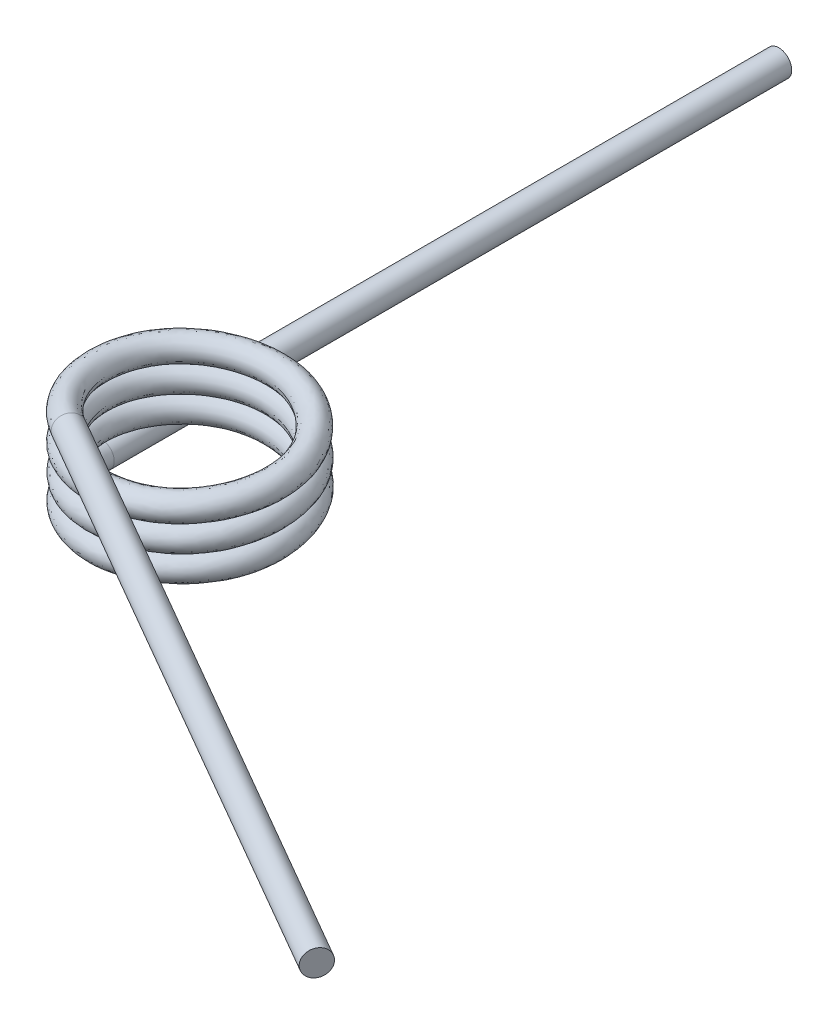
ISO-10303-21;
HEADER;
FILE_DESCRIPTION(('STEP AP214'),'2;1');
FILE_NAME('part.step','',(''),(''),'','','');
FILE_SCHEMA(('AUTOMOTIVE_DESIGN { 1 0 10303 214 1 1 1 1 }'));
ENDSEC;
DATA;
#1=APPLICATION_CONTEXT('core data for automotive mechanical design processes');
#2=APPLICATION_PROTOCOL_DEFINITION('international standard','automotive_design',2000,#1);
#3=PRODUCT_CONTEXT('',#1,'mechanical');
#4=PRODUCT('Part','Part','',(#3));
#5=PRODUCT_RELATED_PRODUCT_CATEGORY('part','',(#4));
#6=PRODUCT_DEFINITION_FORMATION('','',#4);
#7=PRODUCT_DEFINITION_CONTEXT('part definition',#1,'design');
#8=PRODUCT_DEFINITION('design','',#6,#7);
#9=PRODUCT_DEFINITION_SHAPE('','',#8);
#10=(LENGTH_UNIT() NAMED_UNIT(*) SI_UNIT(.MILLI.,.METRE.));
#11=(NAMED_UNIT(*) PLANE_ANGLE_UNIT() SI_UNIT($,.RADIAN.));
#12=(NAMED_UNIT(*) SI_UNIT($,.STERADIAN.) SOLID_ANGLE_UNIT());
#13=UNCERTAINTY_MEASURE_WITH_UNIT(LENGTH_MEASURE(1.E-05),#10,'distance_accuracy_value','');
#14=(GEOMETRIC_REPRESENTATION_CONTEXT(3) GLOBAL_UNCERTAINTY_ASSIGNED_CONTEXT((#13)) GLOBAL_UNIT_ASSIGNED_CONTEXT((#10,
#11,#12)) REPRESENTATION_CONTEXT('',''));
#15=CARTESIAN_POINT('',(0.,0.,0.));
#16=DIRECTION('',(0.,0.,1.));
#17=DIRECTION('',(1.,0.,0.));
#18=AXIS2_PLACEMENT_3D('',#15,#16,#17);
#19=CARTESIAN_POINT('',(31.2249907475932,4.75,23.9167295593006));
#20=DIRECTION('',(-0.86602540378444,0.,-0.499999999999998));
#21=DIRECTION('',(0.499999999999998,0.,-0.86602540378444));
#22=AXIS2_PLACEMENT_3D('',#19,#20,#21);
#23=PLANE('',#22);
#24=CARTESIAN_POINT('',(31.2249907475932,4.75,23.9167295593006));
#25=DIRECTION('',(0.86602540378444,0.,0.499999999999998));
#26=DIRECTION('',(0.499999999999998,0.,-0.86602540378444));
#27=AXIS2_PLACEMENT_3D('',#24,#25,#26);
#28=CIRCLE('',#27,0.745000000000001);
#29=CARTESIAN_POINT('',(31.5974907475932,4.75,23.2715406334812));
#30=VERTEX_POINT('',#29);
#31=EDGE_CURVE('E52',#30,#30,#28,.T.);
#32=ORIENTED_EDGE('',*,*,#31,.T.);
#33=EDGE_LOOP('',(#32));
#34=FACE_BOUND('',#33,.T.);
#35=ADVANCED_FACE('F37',(#34),#23,.F.);
#36=CARTESIAN_POINT('',(-5.10000000000001,0.,-39.));
#37=DIRECTION('',(0.,0.,-1.));
#38=DIRECTION('',(0.999999993495773,0.000114054609235302,0.));
#39=AXIS2_PLACEMENT_3D('',#36,#37,#38);
#40=PLANE('',#39);
#41=CARTESIAN_POINT('',(-5.10000000000001,0.,-39.));
#42=DIRECTION('',(0.,0.,1.));
#43=DIRECTION('',(0.999999993495773,0.000114054609235302,0.));
#44=AXIS2_PLACEMENT_3D('',#41,#42,#43);
#45=CIRCLE('',#44,0.745000000000001);
#46=CARTESIAN_POINT('',(-4.35500000484565,8.49706838837695E-05,-39.));
#47=VERTEX_POINT('',#46);
#48=EDGE_CURVE('E46',#47,#47,#45,.T.);
#49=ORIENTED_EDGE('',*,*,#48,.F.);
#50=EDGE_LOOP('',(#49));
#51=FACE_BOUND('',#50,.T.);
#52=ADVANCED_FACE('F121',(#51),#40,.T.);
#53=CARTESIAN_POINT('',(-2.54999999999986,4.75,4.41672955930073));
#54=DIRECTION('',(0.86602540378444,0.,0.499999999999998));
#55=DIRECTION('',(-0.499999999999998,0.,0.86602540378444));
#56=AXIS2_PLACEMENT_3D('',#53,#54,#55);
#57=CYLINDRICAL_SURFACE('',#56,0.745000000000001);
#58=ORIENTED_EDGE('',*,*,#31,.F.);
#59=EDGE_LOOP('',(#58));
#60=FACE_BOUND('',#59,.T.);
#61=CARTESIAN_POINT('',(-2.54999999999986,4.75,4.41672955930072));
#62=DIRECTION('',(0.865078141904125,0.0467590761205418,0.49945309809837));
#63=DIRECTION('',(0.499999999999971,0.,-0.866025403784455));
#64=AXIS2_PLACEMENT_3D('',#61,#62,#63);
#65=CIRCLE('',#64,0.745000000000001);
#66=CARTESIAN_POINT('',(-2.17749999999988,4.75,3.77154063348131));
#67=VERTEX_POINT('',#66);
#68=EDGE_CURVE('E40',#67,#67,#65,.T.);
#69=ORIENTED_EDGE('',*,*,#68,.T.);
#70=EDGE_LOOP('',(#69));
#71=FACE_BOUND('',#70,.T.);
#72=ADVANCED_FACE('F87',(#60,#71),#57,.T.);
#73=CARTESIAN_POINT('',(-4.35500000484566,8.4877742623831E-05,-3.97315071815063E-06));
#74=CARTESIAN_POINT('',(-4.35500049170202,0.0318251134411877,0.580614354438543));
#75=CARTESIAN_POINT('',(-4.23649721866778,0.063729367407448,1.15898934681182));
#76=CARTESIAN_POINT('',(-3.34382063298611,0.189542885597735,3.28676576476937));
#77=CARTESIAN_POINT('',(-1.64198350085021,0.285312357409099,4.39030935080915));
#78=CARTESIAN_POINT('',(1.82038378485511,0.474574749289196,4.31786427379338));
#79=CARTESIAN_POINT('',(3.47975661831981,0.570680960795654,3.13679904669797));
#80=CARTESIAN_POINT('',(4.6839424903672,0.759399147763516,-0.100663864274794));
#81=CARTESIAN_POINT('',(4.19578314370466,0.855808187502097,-2.08224169545152));
#82=CARTESIAN_POINT('',(1.63240436818566,1.04427251357359,-4.39049577210398));
#83=CARTESIAN_POINT('',(-0.393091437395059,1.14090778587485,-4.66687505817929));
#84=CARTESIAN_POINT('',(-3.28620030909251,1.31737576799788,-3.23081301512258));
#85=CARTESIAN_POINT('',(-4.24568962950082,1.40117141018875,-1.79832159252085));
#86=CARTESIAN_POINT('',(-4.46414136402237,1.58364356683938,1.51850371389457));
#87=CARTESIAN_POINT('',(-3.33398435375743,1.68231651922826,3.33163819513206));
#88=CARTESIAN_POINT('',(0.00172474381694135,1.88037268477069,4.71531052251249));
#89=CARTESIAN_POINT('',(2.08468449364732,1.97945582915349,4.22659895091506));
#90=CARTESIAN_POINT('',(4.46420956670509,2.17696977865345,1.51568252556366));
#91=CARTESIAN_POINT('',(4.67193967777642,2.27665500806439,-0.617961506534757));
#92=CARTESIAN_POINT('',(2.90720385488493,2.46948952573049,-3.67457675764206));
#93=CARTESIAN_POINT('',(1.07004084216657,2.56581083547879,-4.56023571166635));
#94=CARTESIAN_POINT('',(-2.34230030936542,2.75426742698741,-4.05634457904224));
#95=CARTESIAN_POINT('',(-3.84659862477311,2.85093068165208,-2.67149936493476));
#96=CARTESIAN_POINT('',(-4.63326245470203,3.039151741324,0.682515674619303));
#97=CARTESIAN_POINT('',(-3.89952833681768,3.13595758715839,2.59332510242046));
#98=CARTESIAN_POINT('',(-1.07137739662564,3.3241281359151,4.55889107358654));
#99=CARTESIAN_POINT('',(0.974999867533546,3.42091086631926,4.5808468289081));
#100=CARTESIAN_POINT('',(3.84508417751437,3.60917709184034,2.67386817721572));
#101=CARTESIAN_POINT('',(4.61848238139732,3.70581236414485,0.781548440294886));
#102=CARTESIAN_POINT('',(3.90116810590661,3.8942766902123,-2.59253037609087));
#103=CARTESIAN_POINT('',(2.42915237050127,3.99068572995327,-4.00607907497628));
#104=CARTESIAN_POINT('',(-0.97666517729352,4.17940391691991,-4.58195800797555));
#105=CARTESIAN_POINT('',(-2.82918487864243,4.27551012841177,-3.73543333767367));
#106=CARTESIAN_POINT('',(-4.62311044298779,4.46477252033562,-0.773159450934701));
#107=CARTESIAN_POINT('',(-4.51833416186937,4.56054199214867,1.25244664888496));
#108=CARTESIAN_POINT('',(-3.12196563467214,4.68635551025648,3.0894166834495));
#109=CARTESIAN_POINT('',(-2.68033020665044,4.71825976418374,3.48123144049018));
#110=CARTESIAN_POINT('',(-2.17749999999989,4.75,3.77154063348131));
#111=CARTESIAN_POINT('',(-4.3550444953917,0.38973929085154,-0.0182438043106747));
#112=CARTESIAN_POINT('',(-4.3574306773005,0.421479017671261,0.562370637803314));
#113=CARTESIAN_POINT('',(-4.24143373838931,0.453383421192855,1.14127095934507));
#114=CARTESIAN_POINT('',(-3.35732175797539,0.579197318637322,3.27265354469486));
#115=CARTESIAN_POINT('',(-1.66037831683068,0.674966753419761,4.38361648446119));
#116=CARTESIAN_POINT('',(1.80230383102391,0.864228999832589,4.32536030468173));
#117=CARTESIAN_POINT('',(3.46679615786637,0.960335234595801,3.15145140883677));
#118=CARTESIAN_POINT('',(4.68422639277113,1.14905345994167,-0.0811043425544822));
#119=CARTESIAN_POINT('',(4.20464174518784,1.24546246580037,-2.06480433178418));
#120=CARTESIAN_POINT('',(1.65068884393225,1.43392682339603,-4.3835528539704));
#121=CARTESIAN_POINT('',(-0.373620759624214,1.53056206393764,-4.66869917807277));
#122=CARTESIAN_POINT('',(-3.27261714852066,1.70703007601791,-3.2444604959463));
#123=CARTESIAN_POINT('',(-4.23812742948987,1.79082613925565,-1.81611002307953));
#124=CARTESIAN_POINT('',(-4.4706084694056,1.97329766548903,1.49980823635831));
#125=CARTESIAN_POINT('',(-3.34795401276403,2.07197143910668,3.31768534042661));
#126=CARTESIAN_POINT('',(-0.0180403796332627,2.27002653825817,4.71537739474777));
#127=CARTESIAN_POINT('',(2.06704907975083,2.36911060368314,4.23540387823056));
#128=CARTESIAN_POINT('',(4.45784688677571,2.56662365282058,1.53435744287542));
#129=CARTESIAN_POINT('',(4.6747074005595,2.66630928507762,-0.598484136233415));
#130=CARTESIAN_POINT('',(2.92246185337478,2.85914383612168,-3.66233179745202));
#131=CARTESIAN_POINT('',(1.08912348397895,2.95546511320492,-4.55594663460747));
#132=CARTESIAN_POINT('',(-2.3252959441487,3.14392173734658,-4.06600699417536));
#133=CARTESIAN_POINT('',(-3.83559468256182,3.24058495935131,-2.68766510414871));
#134=CARTESIAN_POINT('',(-4.63597819024973,3.42880605171079,0.663150434851775));
#135=CARTESIAN_POINT('',(-3.91050923386143,3.5256118647574,2.57714451170451));
#136=CARTESIAN_POINT('',(-1.09038141669799,3.71378244640268,4.55428586189826));
#137=CARTESIAN_POINT('',(0.955911186190963,3.81056514375629,4.58509727078069));
#138=CARTESIAN_POINT('',(3.83380861711362,3.99883140249007,2.68984538124814));
#139=CARTESIAN_POINT('',(4.61540012710842,4.09546664134996,0.800862976099092));
#140=CARTESIAN_POINT('',(3.91187980144788,4.28393100113013,-2.57616667756522));
#141=CARTESIAN_POINT('',(2.44597455270861,4.38034000938844,-3.99609432698432));
#142=CARTESIAN_POINT('',(-0.95750588145527,4.56905822342076,-4.58590277047718));
#143=CARTESIAN_POINT('',(-2.81368190912862,4.66516434884167,-3.74738141755824));
#144=CARTESIAN_POINT('',(-4.61975659764474,4.85442694762664,-0.792443928115588));
#145=CARTESIAN_POINT('',(-4.52385147960822,4.95019637584874,1.2337107799021));
#146=CARTESIAN_POINT('',(-3.13487375476189,5.07600957814852,3.07631401487484));
#147=CARTESIAN_POINT('',(-2.69494216834125,5.10791365766567,3.47004045707954));
#148=CARTESIAN_POINT('',(-2.19329615724789,5.13965441564331,3.76242071784201));
#149=CARTESIAN_POINT('',(-4.71000388540033,0.74422955320838,-0.0348375918200958));
#150=CARTESIAN_POINT('',(-4.71455967713253,0.776075123285141,0.594473174597862));
#151=CARTESIAN_POINT('',(-4.59163304718302,0.807781040852514,1.21853993434564));
#152=CARTESIAN_POINT('',(-3.64119863483831,0.934101416256235,3.52986305417131));
#153=CARTESIAN_POINT('',(-1.81309820877475,1.02922768950069,4.73536929162904));
#154=CARTESIAN_POINT('',(1.93640113694846,1.21897955229465,4.68402671420544));
#155=CARTESIAN_POINT('',(3.73781945985087,1.3145847279768,3.42250394913862));
#156=CARTESIAN_POINT('',(5.06698587987142,1.50382504584378,-0.073595135272259));
#157=CARTESIAN_POINT('',(4.5562930567729,1.59971260049839,-2.21715158774708));
#158=CARTESIAN_POINT('',(1.79871144232021,1.78869741486976,-4.73653229137578));
#159=CARTESIAN_POINT('',(-0.3859570754249,1.88481246259036,-5.0516798270641));
#160=CARTESIAN_POINT('',(-3.52981044259895,2.06176782940759,-3.51931634967181));
#161=CARTESIAN_POINT('',(-4.57732636628793,2.1454155726667,-1.97819271011646));
#162=CARTESIAN_POINT('',(-4.84025928792386,2.32768000475887,1.60547371382181));
#163=CARTESIAN_POINT('',(-3.63231693014202,2.42649103322875,3.57655020059201));
#164=CARTESIAN_POINT('',(-0.0363415266428423,2.6244781554662,5.09954733878323));
#165=CARTESIAN_POINT('',(2.22024333216342,2.7235041443518,4.58862591388376));
#166=CARTESIAN_POINT('',(4.81629870354265,2.92120768729321,1.67439859419247));
#167=CARTESIAN_POINT('',(5.05913211866519,3.02054793186109,-0.629119630122376));
#168=CARTESIAN_POINT('',(3.17215984485344,3.21391505086623,-3.95258351228918));
#169=CARTESIAN_POINT('',(1.19588447681013,3.30971523754061,-4.92401349945209));
#170=CARTESIAN_POINT('',(-2.50291005335415,3.49869233866161,-4.40505321815508));
#171=CARTESIAN_POINT('',(-4.13856316956631,3.59483541492575,-2.92224861443001));
#172=CARTESIAN_POINT('',(-5.01655131330705,3.7835763332775,0.703311890226331));
#173=CARTESIAN_POINT('',(-4.24011786905383,3.87986239603597,2.77250724674309));
#174=CARTESIAN_POINT('',(-1.19316630797024,4.06855266137943,4.92289554942145));
#175=CARTESIAN_POINT('',(1.0161580276061,4.16481555030268,4.96351542009352));
#176=CARTESIAN_POINT('',(4.13875830423228,4.35360174832534,2.92106691394328));
#177=CARTESIAN_POINT('',(4.98944909100381,4.4497167928321,0.884298869044787));
#178=CARTESIAN_POINT('',(4.23909700445409,4.63870161138185,-2.77473204574996));
#179=CARTESIAN_POINT('',(2.66143819701573,4.73458917061701,-4.31312278164007));
#180=CARTESIAN_POINT('',(-1.02186074916009,4.92382946687584,-4.96327742408375));
#181=CARTESIAN_POINT('',(-3.0290118780021,5.01943443375035,-4.06455226657031));
#182=CARTESIAN_POINT('',(-4.99459760573741,5.20918696946636,-0.87114437221762));
#183=CARTESIAN_POINT('',(-4.8985371209887,5.30431323017871,1.31684712085486));
#184=CARTESIAN_POINT('',(-3.40034917397227,5.43063227806782,3.31709039507403));
#185=CARTESIAN_POINT('',(-2.92787544230098,5.46233748830618,3.74287570170657));
#186=CARTESIAN_POINT('',(-2.38512789418403,5.49418511616661,4.06149167185719));
#187=CARTESIAN_POINT('',(-5.49016605596745,0.744140669444154,-0.0348334311464499));
#188=CARTESIAN_POINT('',(-5.49472007089267,0.776222162641322,0.701527246462671));
#189=CARTESIAN_POINT('',(-5.35154782484295,0.807489233928933,1.42382489031075));
#190=CARTESIAN_POINT('',(-4.23819807728199,0.934922161312581,4.12347052582096));
#191=CARTESIAN_POINT('',(-2.11200858904863,1.02863474820489,5.52195765151017));
#192=CARTESIAN_POINT('',(2.26732596793801,1.21946314828396,5.4574343594456));
#193=CARTESIAN_POINT('',(4.35948809007298,1.31396687842377,3.9890112041721));
#194=CARTESIAN_POINT('',(5.90777778839171,1.50435475305072,-0.0962078746411478));
#195=CARTESIAN_POINT('',(5.31155537925926,1.59909615165868,-2.58690722051508));
#196=CARTESIAN_POINT('',(2.08751718471482,1.78922494088962,-5.52631706227848));
#197=CARTESIAN_POINT('',(-0.452015405116702,1.88419659443169,-5.889877445848));
#198=CARTESIAN_POINT('',(-4.12232415152492,2.06222317625975,-4.09619359038129));
#199=CARTESIAN_POINT('',(-5.33805820345847,2.14554404904724,-2.29889661459002));
#200=CARTESIAN_POINT('',(-5.63987007520941,2.32735451964162,1.87513239529861));
#201=CARTESIAN_POINT('',(-4.22944769062727,2.42646561131303,4.17347763743608));
#202=CARTESIAN_POINT('',(-0.0370398000456911,2.62430544341754,5.94387369228625));
#203=CARTESIAN_POINT('',(2.59225688388097,2.72320192973877,5.34744825929847));
#204=CARTESIAN_POINT('',(5.61695206507592,2.92132600584084,1.94487909923312));
#205=CARTESIAN_POINT('',(5.89861680067396,3.01990623351941,-0.735415537240408));
#206=CARTESIAN_POINT('',(3.69051549601561,3.21444394579059,-4.61508792431861));
#207=CARTESIAN_POINT('',(1.39239501795263,3.30909876707092,-5.74165489646585));
#208=CARTESIAN_POINT('',(-2.92733982112221,3.49921988523695,-5.13100014059636));
#209=CARTESIAN_POINT('',(-4.82653881694232,3.59421967261314,-3.40556500787036));
#210=CARTESIAN_POINT('',(-5.84767361684803,3.78410317695192,0.830322952528635));
#211=CARTESIAN_POINT('',(-4.94268266712284,3.87924682034216,3.23430346579109));
#212=CARTESIAN_POINT('',(-1.3810940566919,4.06907935846817,5.74236241706422));
#213=CARTESIAN_POINT('',(1.18676650415785,4.16419970074109,5.78683137264625));
#214=CARTESIAN_POINT('',(4.83163214721448,4.35412873274812,3.39737027352977));
#215=CARTESIAN_POINT('',(5.8178263458018,4.44910038307459,1.02907373993563));
#216=CARTESIAN_POINT('',(4.93694349797091,4.63922917648565,-3.24393432291675));
#217=CARTESIAN_POINT('',(3.10141352357758,4.7339705796753,-5.02996584630294));
#218=CARTESIAN_POINT('',(-1.20164047990981,4.92435843269058,-5.78491098361934));
#219=CARTESIAN_POINT('',(-3.53334367041954,5.01886195403862,-4.73784267848973));
#220=CARTESIAN_POINT('',(-5.82525906829582,5.20969102699756,-1.00557017128616));
#221=CARTESIAN_POINT('',(-5.7111147392635,5.30340360135565,1.53706434347829));
#222=CARTESIAN_POINT('',(-3.95808560885122,5.4308352013091,3.87255641171183));
#223=CARTESIAN_POINT('',(-3.41067090913251,5.46210148617539,4.36498870104154));
#224=CARTESIAN_POINT('',(-2.77520898200474,5.49418511616661,4.73713193503445));
#225=CARTESIAN_POINT('',(-5.8450444857004,0.389569535366293,-0.0182358580093356));
#226=CARTESIAN_POINT('',(-5.84742837548999,0.421759613452854,0.766831884058172));
#227=CARTESIAN_POINT('',(-5.69276405670763,0.452826111021069,1.53333634515929));
#228=CARTESIAN_POINT('',(-4.49750670543015,0.580764826230128,4.40636030511692));
#229=CARTESIAN_POINT('',(-2.23125509157419,0.673834318962161,5.88588959229558));
#230=CARTESIAN_POINT('',(2.43432370274869,0.865152600137799,5.80246010187127));
#231=CARTESIAN_POINT('',(4.65409578345183,0.959155228872061,4.23340056806802));
#232=CARTESIAN_POINT('',(6.29002065299791,1.1500651261845,-0.124291493522663));
#233=CARTESIAN_POINT('',(5.6470865286454,1.24428513524018,-2.77098557207351));
#234=CARTESIAN_POINT('',(2.20226718187703,1.43493432388024,-5.89193065718865));
#235=CARTESIAN_POINT('',(-0.499782876054811,1.52938584239884,-6.26953870988398));
#236=CARTESIAN_POINT('',(-4.40423497602712,1.70789972444415,-4.34621486893682));
#237=CARTESIAN_POINT('',(-5.69101821652968,1.79107151107028,-2.42860936305028));
#238=CARTESIAN_POINT('',(-5.99775258155524,1.97267603470259,2.01481838159142));
#239=CARTESIAN_POINT('',(-4.48838975921415,2.07192288682391,4.45773276731291));
#240=CARTESIAN_POINT('',(-0.0193739835888567,2.26969668254302,6.32792194766549));
#241=CARTESIAN_POINT('',(2.77754262758176,2.36853341628822,5.68464780464523));
#242=CARTESIAN_POINT('',(5.986982169075,2.56684962460162,2.0509371555233));
#243=CARTESIAN_POINT('',(6.27800504205816,2.66508373152182,-0.801494364822459));
#244=CARTESIAN_POINT('',(3.91244822332048,2.86015395101995,-4.92762202137868));
#245=CARTESIAN_POINT('',(1.46443097188663,2.95428774133513,-6.11752667474606));
#246=CARTESIAN_POINT('',(-3.13589709057404,3.14492927708825,-5.45246348771893));
#247=CARTESIAN_POINT('',(-5.14953138263919,3.23940897815705,-3.61073142126901));
#248=CARTESIAN_POINT('',(-6.22330486532286,3.42981224901263,0.905723695564699));
#249=CARTESIAN_POINT('',(-5.25230915933328,3.52443620177992,3.45911032326637));
#250=CARTESIAN_POINT('',(-1.44929697852486,3.71478836374818,6.11935229411259));
#251=CARTESIAN_POINT('',(1.28174937471045,3.80938895773433,6.15751491367811));
#252=CARTESIAN_POINT('',(5.15710018170955,3.9998378685987,3.59951779032644));
#253=CARTESIAN_POINT('',(6.19748414526889,4.0942893854303,1.07736261216801));
#254=CARTESIAN_POINT('',(5.24466842898991,4.28493857626012,-3.47227701823376));
#255=CARTESIAN_POINT('',(3.28626552944709,4.37915858771501,-5.36516373293215));
#256=CARTESIAN_POINT('',(-1.30085987526286,4.5700684737104,-6.15510727939953));
#257=CARTESIAN_POINT('',(-3.77688468179442,4.66407099313385,-5.03327138387856));
#258=CARTESIAN_POINT('',(-6.20620313126388,4.85538962659549,-1.04917829292555));
#259=CARTESIAN_POINT('',(-6.07576041475512,4.94845911276462,1.65429469433162));
#260=CARTESIAN_POINT('',(-4.20007188139795,5.07639713299196,4.1371759620793));
#261=CARTESIAN_POINT('',(-3.61701046162491,5.10746321600436,4.65818931324847));
#262=CARTESIAN_POINT('',(-2.93829615724785,5.13965441564331,5.05279856948085));
#263=CARTESIAN_POINT('',(-5.84495550460832,-0.389739290851539,0.0182438043105776));
#264=CARTESIAN_POINT('',(-5.84257049690338,-0.357548104664238,0.803326159150884));
#265=CARTESIAN_POINT('',(-5.68289101726457,-0.326481996549745,1.56877312009281));
#266=CARTESIAN_POINT('',(-4.47050445545159,-0.198544039849048,4.43458474526594));
#267=CARTESIAN_POINT('',(-2.1944654596203,-0.105474473059162,5.89927532499151));
#268=CARTESIAN_POINT('',(2.47048361041811,0.0858440990510125,5.78746804009457));
#269=CARTESIAN_POINT('',(4.6800167043587,0.179846681271766,4.20409584378341));
#270=CARTESIAN_POINT('',(6.28945284819005,0.370756501828188,-0.163410536956268));
#271=CARTESIAN_POINT('',(5.62936932567553,0.464976578644515,-2.8058602994117));
#272=CARTESIAN_POINT('',(2.16569823038737,0.655625704234467,-5.90581649345231));
#273=CARTESIAN_POINT('',(-0.538724231603514,0.750077286272374,-6.26589047009702));
#274=CARTESIAN_POINT('',(-4.43140129716467,0.928591108404852,-4.31891990728938));
#275=CARTESIAN_POINT('',(-5.70614261655158,1.01176205293648,-2.39303250193291));
#276=CARTESIAN_POINT('',(-5.98481837078877,1.1933678374033,2.05220933666393));
#277=CARTESIAN_POINT('',(-4.46045044120096,1.29261304706799,4.48563847672382));
#278=CARTESIAN_POINT('',(0.0201562633115513,1.49038897556715,6.32778820319493));
#279=CARTESIAN_POINT('',(2.81281345537474,1.5892238672289,5.66703795001055));
#280=CARTESIAN_POINT('',(5.99970752893375,1.78754187626737,2.01358732090347));
#281=CARTESIAN_POINT('',(6.27246959649201,1.88577517749537,-0.840449105439825));
#282=CARTESIAN_POINT('',(3.88193222634078,2.08084533023758,-4.95211194174467));
#283=CARTESIAN_POINT('',(1.42626568826186,2.17497918588376,-6.12610482886382));
#284=CARTESIAN_POINT('',(-3.1699058210075,2.36562065636901,-5.4331386574527));
#285=CARTESIAN_POINT('',(-5.17153926706177,2.46010042275859,-3.5783999428411));
#286=CARTESIAN_POINT('',(-6.21787339422747,2.65050362823905,0.944454175099754));
#287=CARTESIAN_POINT('',(-5.23034736524928,2.74512764658189,3.49147150469477));
#288=CARTESIAN_POINT('',(-1.41128893837667,2.93547974277301,6.12856271749266));
#289=CARTESIAN_POINT('',(1.31992673740963,3.03008040286028,6.14901402993292));
#290=CARTESIAN_POINT('',(5.17965130249703,3.22052924729923,3.56756338226161));
#291=CARTESIAN_POINT('',(6.20364865384668,3.31498083102007,1.03873354056661));
#292=CARTESIAN_POINT('',(5.22324503790736,3.50562995442446,-3.50500441529208));
#293=CARTESIAN_POINT('',(3.2526211650324,3.5998500288438,-5.38513322891607));
#294=CARTESIAN_POINT('',(-1.33917846693936,3.79075986070957,-6.14721775439627));
#295=CARTESIAN_POINT('',(-3.80789062082205,3.88476255227316,-5.0093752241024));
#296=CARTESIAN_POINT('',(-6.21291082194997,4.07608077201432,-1.01060933857082));
#297=CARTESIAN_POINT('',(-6.06472577927037,4.16915034536447,1.69176643229733));
#298=CARTESIAN_POINT('',(-4.17425564122078,4.29708899720787,4.16338129922862));
#299=CARTESIAN_POINT('',(-3.58777936676728,4.32815551996298,4.68057254225208));
#300=CARTESIAN_POINT('',(-2.90670384275184,4.36034558435668,5.07103840075944));
#301=CARTESIAN_POINT('',(-5.48999611459968,-0.744229553208377,0.0348375918199986));
#302=CARTESIAN_POINT('',(-5.48544131159616,-0.712145948986993,0.771223722031593));
#303=CARTESIAN_POINT('',(-5.33269170847203,-0.680879616209112,1.49150414509224));
#304=CARTESIAN_POINT('',(-4.18662757858514,-0.55344813746884,4.1773752357895));
#305=CARTESIAN_POINT('',(-2.04174556767622,-0.459735409140091,5.54752251782014));
#306=CARTESIAN_POINT('',(2.33638630449356,-0.268906453411049,5.42880163057437));
#307=CARTESIAN_POINT('',(4.4089934023742,-0.174402812108357,3.93304330348155));
#308=CARTESIAN_POINT('',(5.90669336108976,0.0159849159252,-0.170919744238498));
#309=CARTESIAN_POINT('',(5.27771801409046,0.110726443946497,-2.6535130434488));
#310=CARTESIAN_POINT('',(2.01767563199941,0.300855112760742,-5.55283705604693));
#311=CARTESIAN_POINT('',(-0.526387915809839,0.395826887617899,-5.88290982110043));
#312=CARTESIAN_POINT('',(-4.17420800308025,0.573853355016706,-4.04406405356847));
#313=CARTESIAN_POINT('',(-5.36694367975506,0.657172619523113,-2.23094981489598));
#314=CARTESIAN_POINT('',(-5.61516755226868,0.83898549813621,1.94654385920044));
#315=CARTESIAN_POINT('',(-4.17608752382297,0.938093452944998,4.22677361655108));
#316=CARTESIAN_POINT('',(0.0384574103211239,1.13593735836004,5.94361825916682));
#317=CARTESIAN_POINT('',(2.65961920296215,1.23483032656025,5.31381591434634));
#318=CARTESIAN_POINT('',(5.64125571216682,1.43295784179474,1.87354616959743));
#319=CARTESIAN_POINT('',(5.88804487838447,1.53153653071374,-0.809813611543523));
#320=CARTESIAN_POINT('',(3.63223423486388,1.72607411549126,-4.66186022691455));
#321=CARTESIAN_POINT('',(1.31950469543069,1.82072906154631,-5.75803796402974));
#322=CARTESIAN_POINT('',(-2.99229171180204,2.01085005505575,-5.09409243346243));
#323=CARTESIAN_POINT('',(-4.86857078005728,2.10584996718592,-3.3438164325598));
#324=CARTESIAN_POINT('',(-5.83730027117015,2.29573334667058,0.904292719725198));
#325=CARTESIAN_POINT('',(-4.9007387300639,2.39087711530025,3.2961087696562));
#326=CARTESIAN_POINT('',(-1.3085040470974,2.58070952779933,5.75995302996948));
#327=CARTESIAN_POINT('',(1.25967989598047,2.67582999631608,5.77059588062359));
#328=CARTESIAN_POINT('',(4.87470161539239,2.86575890146176,3.33634184956295));
#329=CARTESIAN_POINT('',(5.82959968994427,2.96073067953706,0.95529764762092));
#330=CARTESIAN_POINT('',(4.89602783490816,3.15085934417361,-3.30643904710734));
#331=CARTESIAN_POINT('',(3.0371575207253,3.24560086761698,-5.06810477426733));
#332=CARTESIAN_POINT('',(-1.27482359923453,3.43598861725274,-5.76984310078269));
#333=CARTESIAN_POINT('',(-3.59256065195559,3.53049246736449,-4.69220437509385));
#334=CARTESIAN_POINT('',(-5.83806981385027,3.72132075017461,-0.931908894465275));
#335=CARTESIAN_POINT('',(-5.69004013787932,3.81503349103714,1.60863009135162));
#336=CARTESIAN_POINT('',(-3.9087802220139,3.9424662972877,3.9226049190271));
#337=CARTESIAN_POINT('',(-3.35484620429879,3.97373341652445,4.40773706641226));
#338=CARTESIAN_POINT('',(-2.7148721058157,4.00581488383338,4.77196744674426));
#339=CARTESIAN_POINT('',(-4.70983394403257,-0.744140669444151,0.0348334311463527));
#340=CARTESIAN_POINT('',(-4.7052784658328,-0.712293067203565,0.6641629197614));
#341=CARTESIAN_POINT('',(-4.5727769308121,-0.680587809285532,1.28621918912713));
#342=CARTESIAN_POINT('',(-3.58962813614146,-0.554268882525187,3.58376776413985));
#343=CARTESIAN_POINT('',(-1.74283518740235,-0.459142467843405,4.76093415793901));
#344=CARTESIAN_POINT('',(2.00546147350401,-0.269390049401238,4.65539398533421));
#345=CARTESIAN_POINT('',(3.78732477215561,-0.173784962555327,3.36653604844807));
#346=CARTESIAN_POINT('',(5.06590145256597,0.0154552087182616,-0.148307004869608));
#347=CARTESIAN_POINT('',(4.52245569160411,0.111342892786202,-2.2837574106808));
#348=CARTESIAN_POINT('',(1.72886988960479,0.300327586740885,-4.76305228514422));
#349=CARTESIAN_POINT('',(-0.460329586125051,0.39644275577657,-5.04471220231652));
#350=CARTESIAN_POINT('',(-3.58169429414815,0.573398008164547,-3.46718681285899));
#351=CARTESIAN_POINT('',(-4.60621184258451,0.65704414314258,-1.91024591043475));
#352=CARTESIAN_POINT('',(-4.81555676498313,0.839310983253465,1.67688517773832));
#353=CARTESIAN_POINT('',(-3.57895676334506,0.938118874859803,3.62984617971067));
#354=CARTESIAN_POINT('',(0.0391556837313226,1.13611007040962,5.09929190566013));
#355=CARTESIAN_POINT('',(2.28760565124827,1.23513254117328,4.55499356893163));
#356=CARTESIAN_POINT('',(4.84060235062987,1.43283952324711,1.60306566455678));
#357=CARTESIAN_POINT('',(5.04856019637571,1.53217822905449,-0.703517704418157));
#358=CARTESIAN_POINT('',(3.11387858370171,1.72554522056778,-3.99935581489218));
#359=CARTESIAN_POINT('',(1.12299415428819,1.82134553201512,-4.94039656701599));
#360=CARTESIAN_POINT('',(-2.56786194403398,2.01032250848128,-4.36814551102115));
#361=CARTESIAN_POINT('',(-4.18059513268127,2.10646570950028,-2.86050003911945));
#362=CARTESIAN_POINT('',(-5.00617796762917,2.29520650299441,0.777281657422895));
#363=CARTESIAN_POINT('',(-4.19817393199489,2.39149269099493,2.83431255061171));
#364=CARTESIAN_POINT('',(-1.12057629837574,2.58018283070972,4.94048616232319));
#365=CARTESIAN_POINT('',(1.08907141943573,2.67644584587767,4.94727992807086));
#366=CARTESIAN_POINT('',(4.18182777240318,2.86523191703899,2.86003848997646));
#367=CARTESIAN_POINT('',(5.00122243514629,2.96134708929545,0.810522776730078));
#368=CARTESIAN_POINT('',(4.19818134139134,3.15033177906894,-2.83723676994055));
#369=CARTESIAN_POINT('',(2.59718219416344,3.24621945855782,-4.35126170960447));
#370=CARTESIAN_POINT('',(-1.09504386848481,3.43545965143887,-4.94820954124709));
#371=CARTESIAN_POINT('',(-3.08822885953464,3.53106494707621,-4.01891396317443));
#372=CARTESIAN_POINT('',(-5.00740835129537,3.72081669264341,-0.797483095396734));
#373=CARTESIAN_POINT('',(-4.87746251960804,3.81594311986021,1.38841286872115));
#374=CARTESIAN_POINT('',(-3.35104378713378,3.94226337404642,3.36713890239164));
#375=CARTESIAN_POINT('',(-2.87205779215439,3.97396933923383,3.7856228254406));
#376=CARTESIAN_POINT('',(-2.32479101799499,4.00581488383338,4.096327183567));
#377=CARTESIAN_POINT('',(-4.35495551429962,-0.389569535366292,0.0182358580092384));
#378=CARTESIAN_POINT('',(-4.35257030610354,-0.357828790788886,0.598858071073773));
#379=CARTESIAN_POINT('',(-4.23156069894625,-0.325924686377959,1.17670773427858));
#380=CARTESIAN_POINT('',(-3.33031950799682,-0.200111547441853,3.30087798484388));
#381=CARTESIAN_POINT('',(-1.62358868486975,-0.104342038601562,4.39700221715712));
#382=CARTESIAN_POINT('',(1.8384637386863,0.0849204987458024,4.31036824290503));
#383=CARTESIAN_POINT('',(3.49271707877324,0.181026686995507,3.12214668455917));
#384=CARTESIAN_POINT('',(4.68365858796327,0.369744835585361,-0.120223385995105));
#385=CARTESIAN_POINT('',(4.18692454222148,0.466153909203829,-2.09967905911886));
#386=CARTESIAN_POINT('',(1.61411989243908,0.654618203751142,-4.39743869023757));
#387=CARTESIAN_POINT('',(-0.412562115165904,0.751253507812054,-4.66505093828581));
#388=CARTESIAN_POINT('',(-3.29978346966435,0.927721459977843,-3.21716553429886));
#389=CARTESIAN_POINT('',(-4.25325182951177,1.01151668112185,-1.78053316196217));
#390=CARTESIAN_POINT('',(-4.45767425863913,1.19398946818974,1.53719919143082));
#391=CARTESIAN_POINT('',(-3.32001469475084,1.29266159934983,3.34559104983751));
#392=CARTESIAN_POINT('',(0.0214898672671454,1.49071883128322,4.71524365027721));
#393=CARTESIAN_POINT('',(2.10231990754381,1.58980105462383,4.21779402359955));
#394=CARTESIAN_POINT('',(4.47057224663446,1.78731590448633,1.49700760825191));
#395=CARTESIAN_POINT('',(4.66917195499334,1.88700073105117,-0.637438876836099));
#396=CARTESIAN_POINT('',(2.89194585639508,2.07983521533931,-3.6868217178321));
#397=CARTESIAN_POINT('',(1.0509582003542,2.17615655775266,-4.56452478872523));
#398=CARTESIAN_POINT('',(-2.35930467458214,2.36461311662823,-4.04668216390913));
#399=CARTESIAN_POINT('',(-3.8576025669844,2.46127640395285,-2.6553336257208));
#400=CARTESIAN_POINT('',(-4.63054671915433,2.6494974309372,0.70188091438683));
#401=CARTESIAN_POINT('',(-3.88854743977393,2.74630330955937,2.60950569313642));
#402=CARTESIAN_POINT('',(-1.0523733765533,2.93447382542751,4.56349628527482));
#403=CARTESIAN_POINT('',(0.994088548876128,3.03125658888224,4.5765963870355));
#404=CARTESIAN_POINT('',(3.85635973791513,3.2195227811906,2.6578909731833));
#405=CARTESIAN_POINT('',(4.62156463568622,3.31615808693973,0.76223390449068));
#406=CARTESIAN_POINT('',(3.89045641036534,3.50462237929448,-2.60889407461652));
#407=CARTESIAN_POINT('',(2.41233018829393,3.6010314505181,-4.01606382296824));
#408=CARTESIAN_POINT('',(-0.995824473131769,3.78974961041905,-4.57801324547392));
#409=CARTESIAN_POINT('',(-2.84468784815624,3.88585590798186,-3.72348525778911));
#410=CARTESIAN_POINT('',(-4.62646428833083,4.0751180930446,-0.753874973753814));
#411=CARTESIAN_POINT('',(-4.51281684413052,4.1708876084486,1.27118251786781));
#412=CARTESIAN_POINT('',(-3.10905751458238,4.29670144236443,3.10251935202416));
#413=CARTESIAN_POINT('',(-2.66571824495963,4.32860587070181,3.49242242390082));
#414=CARTESIAN_POINT('',(-2.16170384275189,4.36034558435668,3.7806605491206));
#415=CARTESIAN_POINT('',(-4.35500000484566,8.4877742623831E-05,-3.97315071815063E-06));
#416=CARTESIAN_POINT('',(-4.35500049170202,0.0318251134411877,0.580614354438543));
#417=CARTESIAN_POINT('',(-4.23649721866778,0.063729367407448,1.15898934681182));
#418=CARTESIAN_POINT('',(-3.34382063298611,0.189542885597735,3.28676576476937));
#419=CARTESIAN_POINT('',(-1.64198350085021,0.285312357409099,4.39030935080915));
#420=CARTESIAN_POINT('',(1.82038378485511,0.474574749289196,4.31786427379338));
#421=CARTESIAN_POINT('',(3.47975661831981,0.570680960795654,3.13679904669797));
#422=CARTESIAN_POINT('',(4.6839424903672,0.759399147763516,-0.100663864274794));
#423=CARTESIAN_POINT('',(4.19578314370466,0.855808187502097,-2.08224169545152));
#424=CARTESIAN_POINT('',(1.63240436818566,1.04427251357359,-4.39049577210398));
#425=CARTESIAN_POINT('',(-0.393091437395059,1.14090778587485,-4.66687505817929));
#426=CARTESIAN_POINT('',(-3.28620030909251,1.31737576799788,-3.23081301512258));
#427=CARTESIAN_POINT('',(-4.24568962950082,1.40117141018875,-1.79832159252085));
#428=CARTESIAN_POINT('',(-4.46414136402237,1.58364356683938,1.51850371389457));
#429=CARTESIAN_POINT('',(-3.33398435375743,1.68231651922826,3.33163819513206));
#430=CARTESIAN_POINT('',(0.00172474381694135,1.88037268477069,4.71531052251249));
#431=CARTESIAN_POINT('',(2.08468449364732,1.97945582915349,4.22659895091506));
#432=CARTESIAN_POINT('',(4.46420956670509,2.17696977865345,1.51568252556366));
#433=CARTESIAN_POINT('',(4.67193967777642,2.27665500806439,-0.617961506534757));
#434=CARTESIAN_POINT('',(2.90720385488493,2.46948952573049,-3.67457675764206));
#435=CARTESIAN_POINT('',(1.07004084216657,2.56581083547879,-4.56023571166635));
#436=CARTESIAN_POINT('',(-2.34230030936542,2.75426742698741,-4.05634457904224));
#437=CARTESIAN_POINT('',(-3.84659862477311,2.85093068165208,-2.67149936493476));
#438=CARTESIAN_POINT('',(-4.63326245470203,3.039151741324,0.682515674619303));
#439=CARTESIAN_POINT('',(-3.89952833681768,3.13595758715839,2.59332510242046));
#440=CARTESIAN_POINT('',(-1.07137739662564,3.3241281359151,4.55889107358654));
#441=CARTESIAN_POINT('',(0.974999867533546,3.42091086631926,4.5808468289081));
#442=CARTESIAN_POINT('',(3.84508417751437,3.60917709184034,2.67386817721572));
#443=CARTESIAN_POINT('',(4.61848238139732,3.70581236414485,0.781548440294886));
#444=CARTESIAN_POINT('',(3.90116810590661,3.8942766902123,-2.59253037609087));
#445=CARTESIAN_POINT('',(2.42915237050127,3.99068572995327,-4.00607907497628));
#446=CARTESIAN_POINT('',(-0.97666517729352,4.17940391691991,-4.58195800797555));
#447=CARTESIAN_POINT('',(-2.82918487864243,4.27551012841177,-3.73543333767367));
#448=CARTESIAN_POINT('',(-4.62311044298779,4.46477252033562,-0.773159450934701));
#449=CARTESIAN_POINT('',(-4.51833416186937,4.56054199214867,1.25244664888496));
#450=CARTESIAN_POINT('',(-3.12196563467214,4.68635551025648,3.0894166834495));
#451=CARTESIAN_POINT('',(-2.68033020665044,4.71825976418374,3.48123144049018));
#452=CARTESIAN_POINT('',(-2.17749999999989,4.75,3.77154063348131));
#453=B_SPLINE_SURFACE_WITH_KNOTS('',3,3,((#73,#74,#75,#76,#77,#78,#79,#80,#81,#82,#83,#84,#85,
#86,#87,#88,#89,#90,#91,#92,#93,#94,#95,#96,#97,#98,#99,#100,#101,#102,#103,#104,#105,#106,#107,
#108,#109,#110),(#111,#112,#113,#114,#115,#116,#117,#118,#119,#120,#121,#122,#123,#124,#125,
#126,#127,#128,#129,#130,#131,#132,#133,#134,#135,#136,#137,#138,#139,#140,#141,#142,#143,#144,
#145,#146,#147,#148),(#149,#150,#151,#152,#153,#154,#155,#156,#157,#158,#159,#160,#161,#162,
#163,#164,#165,#166,#167,#168,#169,#170,#171,#172,#173,#174,#175,#176,#177,#178,#179,#180,#181,
#182,#183,#184,#185,#186),(#187,#188,#189,#190,#191,#192,#193,#194,#195,#196,#197,#198,#199,
#200,#201,#202,#203,#204,#205,#206,#207,#208,#209,#210,#211,#212,#213,#214,#215,#216,#217,#218,
#219,#220,#221,#222,#223,#224),(#225,#226,#227,#228,#229,#230,#231,#232,#233,#234,#235,#236,
#237,#238,#239,#240,#241,#242,#243,#244,#245,#246,#247,#248,#249,#250,#251,#252,#253,#254,#255,
#256,#257,#258,#259,#260,#261,#262),(#263,#264,#265,#266,#267,#268,#269,#270,#271,#272,#273,
#274,#275,#276,#277,#278,#279,#280,#281,#282,#283,#284,#285,#286,#287,#288,#289,#290,#291,#292,
#293,#294,#295,#296,#297,#298,#299,#300),(#301,#302,#303,#304,#305,#306,#307,#308,#309,#310,
#311,#312,#313,#314,#315,#316,#317,#318,#319,#320,#321,#322,#323,#324,#325,#326,#327,#328,#329,
#330,#331,#332,#333,#334,#335,#336,#337,#338),(#339,#340,#341,#342,#343,#344,#345,#346,#347,
#348,#349,#350,#351,#352,#353,#354,#355,#356,#357,#358,#359,#360,#361,#362,#363,#364,#365,#366,
#367,#368,#369,#370,#371,#372,#373,#374,#375,#376),(#377,#378,#379,#380,#381,#382,#383,#384,
#385,#386,#387,#388,#389,#390,#391,#392,#393,#394,#395,#396,#397,#398,#399,#400,#401,#402,#403,
#404,#405,#406,#407,#408,#409,#410,#411,#412,#413,#414),(#415,#416,#417,#418,#419,#420,#421,
#422,#423,#424,#425,#426,#427,#428,#429,#430,#431,#432,#433,#434,#435,#436,#437,#438,#439,#440,
#441,#442,#443,#444,#445,#446,#447,#448,#449,#450,#451,#452)),.UNSPECIFIED.,.T.,.F.,.F.,(4,2,2,
2,4),(4,2,2,2,2,2,2,2,2,2,2,2,2,2,2,2,2,2,4),(0.,0.25,0.5,0.75,1.),(0.,0.0199026246500761,
0.080038699427795,0.140037580886942,0.200033894979174,0.260027541621185,0.3125,0.375,0.4375,
0.500000000000001,0.559996921170641,0.61998963043539,0.679980774895382,0.739972458378816,
0.799966105020827,0.859962419113058,0.919961300572205,0.980097375349924,1.),.UNSPECIFIED.);
#454=CARTESIAN_POINT('',(-5.10000000000001,0.,0.));
#455=DIRECTION('',(0.,0.,1.));
#456=DIRECTION('',(0.999999993495773,0.000114054609235302,0.));
#457=AXIS2_PLACEMENT_3D('',#454,#455,#456);
#458=CIRCLE('',#457,0.745000000000001);
#459=CARTESIAN_POINT('',(-4.35500000484433,8.49126018504636E-05,-1.98642263350317E-06));
#460=VERTEX_POINT('',#459);
#461=EDGE_CURVE('E11',#460,#460,#458,.T.);
#462=ORIENTED_EDGE('',*,*,#68,.F.);
#463=EDGE_LOOP('',(#462));
#464=FACE_BOUND('',#463,.T.);
#465=ORIENTED_EDGE('',*,*,#461,.T.);
#466=EDGE_LOOP('',(#465));
#467=FACE_BOUND('',#466,.T.);
#468=ADVANCED_FACE('F65',(#464,#467),#453,.T.);
#469=CARTESIAN_POINT('',(-5.10000000000001,0.,-39.));
#470=DIRECTION('',(0.,0.,1.));
#471=DIRECTION('',(-1.,0.,0.));
#472=AXIS2_PLACEMENT_3D('',#469,#470,#471);
#473=CYLINDRICAL_SURFACE('',#472,0.745000000000001);
#474=ORIENTED_EDGE('',*,*,#461,.F.);
#475=EDGE_LOOP('',(#474));
#476=FACE_BOUND('',#475,.T.);
#477=ORIENTED_EDGE('',*,*,#48,.T.);
#478=EDGE_LOOP('',(#477));
#479=FACE_BOUND('',#478,.T.);
#480=ADVANCED_FACE('F86',(#476,#479),#473,.T.);
#481=CLOSED_SHELL('',(#35,#52,#72,#468,#480));
#482=MANIFOLD_SOLID_BREP('B2',#481);
#483=ADVANCED_BREP_SHAPE_REPRESENTATION('',(#18,#482),#14);
#484=SHAPE_DEFINITION_REPRESENTATION(#9,#483);
ENDSEC;
END-ISO-10303-21;
